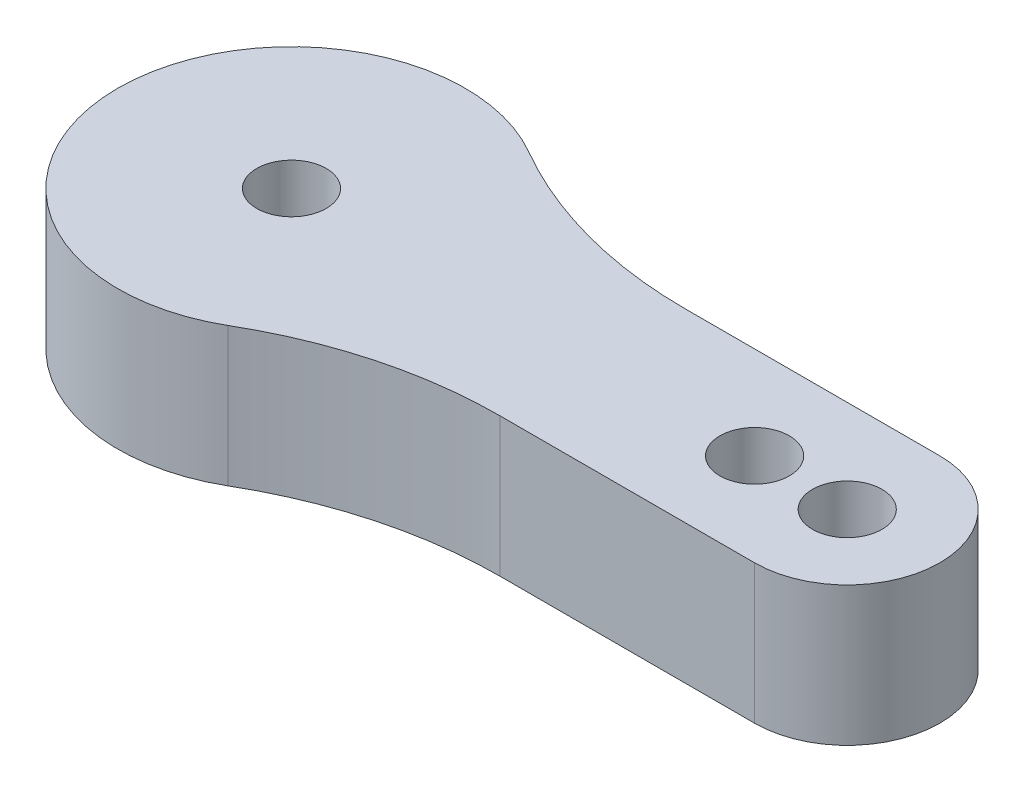
ISO-10303-21;
HEADER;
FILE_DESCRIPTION(('STEP AP214'),'2;1');
FILE_NAME('part.step','',(''),(''),'','','');
FILE_SCHEMA(('AUTOMOTIVE_DESIGN { 1 0 10303 214 1 1 1 1 }'));
ENDSEC;
DATA;
#1=APPLICATION_CONTEXT('core data for automotive mechanical design processes');
#2=APPLICATION_PROTOCOL_DEFINITION('international standard','automotive_design',2000,#1);
#3=PRODUCT_CONTEXT('',#1,'mechanical');
#4=PRODUCT('Part','Part','',(#3));
#5=PRODUCT_RELATED_PRODUCT_CATEGORY('part','',(#4));
#6=PRODUCT_DEFINITION_FORMATION('','',#4);
#7=PRODUCT_DEFINITION_CONTEXT('part definition',#1,'design');
#8=PRODUCT_DEFINITION('design','',#6,#7);
#9=PRODUCT_DEFINITION_SHAPE('','',#8);
#10=(LENGTH_UNIT() NAMED_UNIT(*) SI_UNIT(.MILLI.,.METRE.));
#11=(NAMED_UNIT(*) PLANE_ANGLE_UNIT() SI_UNIT($,.RADIAN.));
#12=(NAMED_UNIT(*) SI_UNIT($,.STERADIAN.) SOLID_ANGLE_UNIT());
#13=UNCERTAINTY_MEASURE_WITH_UNIT(LENGTH_MEASURE(1.E-05),#10,'distance_accuracy_value','');
#14=(GEOMETRIC_REPRESENTATION_CONTEXT(3) GLOBAL_UNCERTAINTY_ASSIGNED_CONTEXT((#13)) GLOBAL_UNIT_ASSIGNED_CONTEXT((#10,
#11,#12)) REPRESENTATION_CONTEXT('',''));
#15=CARTESIAN_POINT('',(0.,0.,0.));
#16=DIRECTION('',(0.,0.,1.));
#17=DIRECTION('',(1.,0.,0.));
#18=AXIS2_PLACEMENT_3D('',#15,#16,#17);
#19=CARTESIAN_POINT('',(16.3682653243977,6.,-10.0000000000006));
#20=DIRECTION('',(0.,1.,0.));
#21=DIRECTION('',(0.,0.,1.));
#22=AXIS2_PLACEMENT_3D('',#19,#20,#21);
#23=PLANE('',#22);
#24=CARTESIAN_POINT('',(12.3682653243977,6.,-10.0000000000006));
#25=DIRECTION('',(0.,1.,0.));
#26=DIRECTION('',(0.,0.,1.));
#27=AXIS2_PLACEMENT_3D('',#24,#25,#26);
#28=CIRCLE('',#27,1.5);
#29=CARTESIAN_POINT('',(12.3682653243977,6.,-8.50000000000061));
#30=VERTEX_POINT('',#29);
#31=EDGE_CURVE('E190',#30,#30,#28,.T.);
#32=ORIENTED_EDGE('',*,*,#31,.F.);
#33=EDGE_LOOP('',(#32));
#34=FACE_BOUND('',#33,.T.);
#35=CARTESIAN_POINT('',(16.3682653243977,6.,-10.0000000000006));
#36=DIRECTION('',(0.,1.,0.));
#37=DIRECTION('',(0.,0.,1.));
#38=AXIS2_PLACEMENT_3D('',#35,#36,#37);
#39=CIRCLE('',#38,4.);
#40=CARTESIAN_POINT('',(16.3682653243977,6.,-6.00000000000062));
#41=VERTEX_POINT('',#40);
#42=CARTESIAN_POINT('',(16.3682653243977,6.,-14.0000000000006));
#43=VERTEX_POINT('',#42);
#44=EDGE_CURVE('E135',#41,#43,#39,.T.);
#45=ORIENTED_EDGE('',*,*,#44,.T.);
#46=DIRECTION('',(-1.,0.,0.));
#47=VECTOR('',#46,1.);
#48=CARTESIAN_POINT('',(16.3682653243977,6.,-14.0000000000006));
#49=LINE('',#48,#47);
#50=CARTESIAN_POINT('',(5.36826532439773,6.,-14.0000000000006));
#51=VERTEX_POINT('',#50);
#52=EDGE_CURVE('E93',#43,#51,#49,.T.);
#53=ORIENTED_EDGE('',*,*,#52,.T.);
#54=CARTESIAN_POINT('',(5.36826532439773,6.,-32.3930795522075));
#55=DIRECTION('',(0.,-1.,0.));
#56=DIRECTION('',(0.,0.,-1.));
#57=AXIS2_PLACEMENT_3D('',#54,#55,#56);
#58=CIRCLE('',#57,18.3930795522069);
#59=CARTESIAN_POINT('',(-3.88173467560219,6.,-16.4951905283838));
#60=VERTEX_POINT('',#59);
#61=EDGE_CURVE('E106',#51,#60,#58,.T.);
#62=ORIENTED_EDGE('',*,*,#61,.T.);
#63=CARTESIAN_POINT('',(-7.63173467560227,6.,-10.0000000000006));
#64=DIRECTION('',(0.,1.,0.));
#65=DIRECTION('',(0.,0.,1.));
#66=AXIS2_PLACEMENT_3D('',#63,#64,#65);
#67=CIRCLE('',#66,7.49999999999999);
#68=CARTESIAN_POINT('',(-3.8817346756022,6.,-3.50480947161738));
#69=VERTEX_POINT('',#68);
#70=EDGE_CURVE('E100',#60,#69,#67,.T.);
#71=ORIENTED_EDGE('',*,*,#70,.T.);
#72=CARTESIAN_POINT('',(5.36826532439773,6.,12.3930795522063));
#73=DIRECTION('',(0.,-1.,0.));
#74=DIRECTION('',(0.,0.,1.));
#75=AXIS2_PLACEMENT_3D('',#72,#73,#74);
#76=CIRCLE('',#75,18.3930795522069);
#77=CARTESIAN_POINT('',(5.36826532439773,6.,-6.00000000000061));
#78=VERTEX_POINT('',#77);
#79=EDGE_CURVE('E104',#69,#78,#76,.T.);
#80=ORIENTED_EDGE('',*,*,#79,.T.);
#81=DIRECTION('',(1.,0.,0.));
#82=VECTOR('',#81,1.);
#83=CARTESIAN_POINT('',(16.3682653243977,6.,-6.00000000000062));
#84=LINE('',#83,#82);
#85=EDGE_CURVE('E56',#78,#41,#84,.T.);
#86=ORIENTED_EDGE('',*,*,#85,.T.);
#87=EDGE_LOOP('',(#45,#53,#62,#71,#80,#86));
#88=FACE_BOUND('',#87,.T.);
#89=CARTESIAN_POINT('',(-7.63173467560227,6.,-10.0000000000006));
#90=DIRECTION('',(0.,1.,0.));
#91=DIRECTION('',(0.,0.,1.));
#92=AXIS2_PLACEMENT_3D('',#89,#90,#91);
#93=CIRCLE('',#92,1.5);
#94=CARTESIAN_POINT('',(-7.63173467560227,6.,-8.50000000000062));
#95=VERTEX_POINT('',#94);
#96=EDGE_CURVE('E128',#95,#95,#93,.T.);
#97=ORIENTED_EDGE('',*,*,#96,.F.);
#98=EDGE_LOOP('',(#97));
#99=FACE_BOUND('',#98,.T.);
#100=CARTESIAN_POINT('',(16.3682653243977,6.,-10.0000000000006));
#101=DIRECTION('',(0.,1.,0.));
#102=DIRECTION('',(0.,0.,1.));
#103=AXIS2_PLACEMENT_3D('',#100,#101,#102);
#104=CIRCLE('',#103,1.5);
#105=CARTESIAN_POINT('',(16.3682653243977,6.,-8.50000000000061));
#106=VERTEX_POINT('',#105);
#107=EDGE_CURVE('E181',#106,#106,#104,.T.);
#108=ORIENTED_EDGE('',*,*,#107,.F.);
#109=EDGE_LOOP('',(#108));
#110=FACE_BOUND('',#109,.T.);
#111=ADVANCED_FACE('F39',(#34,#88,#99,#110),#23,.T.);
#112=CARTESIAN_POINT('',(16.3682653243977,0.,-10.0000000000006));
#113=DIRECTION('',(0.,1.,0.));
#114=DIRECTION('',(0.,0.,1.));
#115=AXIS2_PLACEMENT_3D('',#112,#113,#114);
#116=PLANE('',#115);
#117=CARTESIAN_POINT('',(16.3682653243977,0.,-10.0000000000006));
#118=DIRECTION('',(0.,1.,0.));
#119=DIRECTION('',(0.,0.,1.));
#120=AXIS2_PLACEMENT_3D('',#117,#118,#119);
#121=CIRCLE('',#120,4.);
#122=CARTESIAN_POINT('',(16.3682653243977,0.,-6.00000000000062));
#123=VERTEX_POINT('',#122);
#124=CARTESIAN_POINT('',(16.3682653243977,0.,-14.0000000000006));
#125=VERTEX_POINT('',#124);
#126=EDGE_CURVE('E124',#123,#125,#121,.T.);
#127=ORIENTED_EDGE('',*,*,#126,.F.);
#128=DIRECTION('',(1.,0.,0.));
#129=VECTOR('',#128,1.);
#130=CARTESIAN_POINT('',(16.3682653243977,0.,-6.00000000000062));
#131=LINE('',#130,#129);
#132=CARTESIAN_POINT('',(5.36826532439773,0.,-6.00000000000061));
#133=VERTEX_POINT('',#132);
#134=EDGE_CURVE('E85',#133,#123,#131,.T.);
#135=ORIENTED_EDGE('',*,*,#134,.F.);
#136=CARTESIAN_POINT('',(5.36826532439773,0.,12.3930795522063));
#137=DIRECTION('',(0.,-1.,0.));
#138=DIRECTION('',(0.,0.,1.));
#139=AXIS2_PLACEMENT_3D('',#136,#137,#138);
#140=CIRCLE('',#139,18.3930795522069);
#141=CARTESIAN_POINT('',(-3.8817346756022,0.,-3.50480947161738));
#142=VERTEX_POINT('',#141);
#143=EDGE_CURVE('E79',#142,#133,#140,.T.);
#144=ORIENTED_EDGE('',*,*,#143,.F.);
#145=CARTESIAN_POINT('',(-7.63173467560227,0.,-10.0000000000006));
#146=DIRECTION('',(0.,1.,0.));
#147=DIRECTION('',(0.,0.,1.));
#148=AXIS2_PLACEMENT_3D('',#145,#146,#147);
#149=CIRCLE('',#148,7.49999999999999);
#150=CARTESIAN_POINT('',(-3.88173467560219,0.,-16.4951905283838));
#151=VERTEX_POINT('',#150);
#152=EDGE_CURVE('E114',#151,#142,#149,.T.);
#153=ORIENTED_EDGE('',*,*,#152,.F.);
#154=CARTESIAN_POINT('',(5.36826532439773,0.,-32.3930795522075));
#155=DIRECTION('',(0.,-1.,0.));
#156=DIRECTION('',(0.,0.,-1.));
#157=AXIS2_PLACEMENT_3D('',#154,#155,#156);
#158=CIRCLE('',#157,18.3930795522069);
#159=CARTESIAN_POINT('',(5.36826532439773,0.,-14.0000000000006));
#160=VERTEX_POINT('',#159);
#161=EDGE_CURVE('E130',#160,#151,#158,.T.);
#162=ORIENTED_EDGE('',*,*,#161,.F.);
#163=DIRECTION('',(-1.,0.,0.));
#164=VECTOR('',#163,1.);
#165=CARTESIAN_POINT('',(16.3682653243977,0.,-14.0000000000006));
#166=LINE('',#165,#164);
#167=EDGE_CURVE('E127',#125,#160,#166,.T.);
#168=ORIENTED_EDGE('',*,*,#167,.F.);
#169=EDGE_LOOP('',(#127,#135,#144,#153,#162,#168));
#170=FACE_BOUND('',#169,.T.);
#171=CARTESIAN_POINT('',(-7.63173467560227,0.,-10.0000000000006));
#172=DIRECTION('',(0.,1.,0.));
#173=DIRECTION('',(0.,0.,1.));
#174=AXIS2_PLACEMENT_3D('',#171,#172,#173);
#175=CIRCLE('',#174,1.5);
#176=CARTESIAN_POINT('',(-7.63173467560227,0.,-8.50000000000062));
#177=VERTEX_POINT('',#176);
#178=EDGE_CURVE('E193',#177,#177,#175,.T.);
#179=ORIENTED_EDGE('',*,*,#178,.T.);
#180=EDGE_LOOP('',(#179));
#181=FACE_BOUND('',#180,.T.);
#182=CARTESIAN_POINT('',(12.3682653243977,0.,-10.0000000000006));
#183=DIRECTION('',(0.,1.,0.));
#184=DIRECTION('',(0.,0.,1.));
#185=AXIS2_PLACEMENT_3D('',#182,#183,#184);
#186=CIRCLE('',#185,1.5);
#187=CARTESIAN_POINT('',(12.3682653243977,0.,-8.50000000000061));
#188=VERTEX_POINT('',#187);
#189=EDGE_CURVE('E187',#188,#188,#186,.T.);
#190=ORIENTED_EDGE('',*,*,#189,.T.);
#191=EDGE_LOOP('',(#190));
#192=FACE_BOUND('',#191,.T.);
#193=CARTESIAN_POINT('',(16.3682653243977,0.,-10.0000000000006));
#194=DIRECTION('',(0.,1.,0.));
#195=DIRECTION('',(0.,0.,1.));
#196=AXIS2_PLACEMENT_3D('',#193,#194,#195);
#197=CIRCLE('',#196,1.5);
#198=CARTESIAN_POINT('',(16.3682653243977,0.,-8.50000000000061));
#199=VERTEX_POINT('',#198);
#200=EDGE_CURVE('E184',#199,#199,#197,.T.);
#201=ORIENTED_EDGE('',*,*,#200,.T.);
#202=EDGE_LOOP('',(#201));
#203=FACE_BOUND('',#202,.T.);
#204=ADVANCED_FACE('F144',(#170,#181,#192,#203),#116,.F.);
#205=CARTESIAN_POINT('',(16.3682653243977,6.,-10.0000000000006));
#206=DIRECTION('',(0.,-1.,0.));
#207=DIRECTION('',(0.,0.,-1.));
#208=AXIS2_PLACEMENT_3D('',#205,#206,#207);
#209=CYLINDRICAL_SURFACE('',#208,4.);
#210=ORIENTED_EDGE('',*,*,#126,.T.);
#211=DIRECTION('',(0.,-1.,0.));
#212=VECTOR('',#211,1.);
#213=CARTESIAN_POINT('',(16.3682653243977,6.,-14.0000000000006));
#214=LINE('',#213,#212);
#215=EDGE_CURVE('E11',#43,#125,#214,.T.);
#216=ORIENTED_EDGE('',*,*,#215,.F.);
#217=ORIENTED_EDGE('',*,*,#44,.F.);
#218=DIRECTION('',(0.,-1.,0.));
#219=VECTOR('',#218,1.);
#220=CARTESIAN_POINT('',(16.3682653243977,6.,-6.00000000000062));
#221=LINE('',#220,#219);
#222=EDGE_CURVE('E120',#41,#123,#221,.T.);
#223=ORIENTED_EDGE('',*,*,#222,.T.);
#224=EDGE_LOOP('',(#210,#216,#217,#223));
#225=FACE_BOUND('',#224,.T.);
#226=ADVANCED_FACE('F41',(#225),#209,.T.);
#227=CARTESIAN_POINT('',(16.3682653243977,6.,-14.0000000000006));
#228=DIRECTION('',(0.,0.,1.));
#229=DIRECTION('',(1.,0.,0.));
#230=AXIS2_PLACEMENT_3D('',#227,#228,#229);
#231=PLANE('',#230);
#232=ORIENTED_EDGE('',*,*,#167,.T.);
#233=DIRECTION('',(0.,-1.,0.));
#234=VECTOR('',#233,1.);
#235=CARTESIAN_POINT('',(5.36826532439773,6.,-14.0000000000006));
#236=LINE('',#235,#234);
#237=EDGE_CURVE('E48',#51,#160,#236,.T.);
#238=ORIENTED_EDGE('',*,*,#237,.F.);
#239=ORIENTED_EDGE('',*,*,#52,.F.);
#240=ORIENTED_EDGE('',*,*,#215,.T.);
#241=EDGE_LOOP('',(#232,#238,#239,#240));
#242=FACE_BOUND('',#241,.T.);
#243=ADVANCED_FACE('F247',(#242),#231,.F.);
#244=CARTESIAN_POINT('',(5.36826532439773,6.,-32.3930795522075));
#245=DIRECTION('',(0.,-1.,0.));
#246=DIRECTION('',(0.,0.,-1.));
#247=AXIS2_PLACEMENT_3D('',#244,#245,#246);
#248=CYLINDRICAL_SURFACE('',#247,18.3930795522069);
#249=ORIENTED_EDGE('',*,*,#161,.T.);
#250=DIRECTION('',(0.,-1.,0.));
#251=VECTOR('',#250,1.);
#252=CARTESIAN_POINT('',(-3.88173467560219,6.,-16.4951905283838));
#253=LINE('',#252,#251);
#254=EDGE_CURVE('E115',#60,#151,#253,.T.);
#255=ORIENTED_EDGE('',*,*,#254,.F.);
#256=ORIENTED_EDGE('',*,*,#61,.F.);
#257=ORIENTED_EDGE('',*,*,#237,.T.);
#258=EDGE_LOOP('',(#249,#255,#256,#257));
#259=FACE_BOUND('',#258,.T.);
#260=ADVANCED_FACE('F141',(#259),#248,.F.);
#261=CARTESIAN_POINT('',(-7.63173467560227,6.,-10.0000000000006));
#262=DIRECTION('',(0.,-1.,0.));
#263=DIRECTION('',(0.,0.,-1.));
#264=AXIS2_PLACEMENT_3D('',#261,#262,#263);
#265=CYLINDRICAL_SURFACE('',#264,7.49999999999999);
#266=ORIENTED_EDGE('',*,*,#152,.T.);
#267=DIRECTION('',(0.,-1.,0.));
#268=VECTOR('',#267,1.);
#269=CARTESIAN_POINT('',(-3.8817346756022,6.,-3.50480947161738));
#270=LINE('',#269,#268);
#271=EDGE_CURVE('E111',#69,#142,#270,.T.);
#272=ORIENTED_EDGE('',*,*,#271,.F.);
#273=ORIENTED_EDGE('',*,*,#70,.F.);
#274=ORIENTED_EDGE('',*,*,#254,.T.);
#275=EDGE_LOOP('',(#266,#272,#273,#274));
#276=FACE_BOUND('',#275,.T.);
#277=ADVANCED_FACE('F112',(#276),#265,.T.);
#278=CARTESIAN_POINT('',(5.36826532439773,6.,12.3930795522063));
#279=DIRECTION('',(0.,-1.,0.));
#280=DIRECTION('',(0.,0.,-1.));
#281=AXIS2_PLACEMENT_3D('',#278,#279,#280);
#282=CYLINDRICAL_SURFACE('',#281,18.3930795522069);
#283=ORIENTED_EDGE('',*,*,#143,.T.);
#284=DIRECTION('',(0.,-1.,0.));
#285=VECTOR('',#284,1.);
#286=CARTESIAN_POINT('',(5.36826532439773,6.,-6.00000000000061));
#287=LINE('',#286,#285);
#288=EDGE_CURVE('E116',#78,#133,#287,.T.);
#289=ORIENTED_EDGE('',*,*,#288,.F.);
#290=ORIENTED_EDGE('',*,*,#79,.F.);
#291=ORIENTED_EDGE('',*,*,#271,.T.);
#292=EDGE_LOOP('',(#283,#289,#290,#291));
#293=FACE_BOUND('',#292,.T.);
#294=ADVANCED_FACE('F118',(#293),#282,.F.);
#295=CARTESIAN_POINT('',(16.3682653243977,6.,-6.00000000000062));
#296=DIRECTION('',(0.,0.,-1.));
#297=DIRECTION('',(-1.,0.,0.));
#298=AXIS2_PLACEMENT_3D('',#295,#296,#297);
#299=PLANE('',#298);
#300=ORIENTED_EDGE('',*,*,#134,.T.);
#301=ORIENTED_EDGE('',*,*,#222,.F.);
#302=ORIENTED_EDGE('',*,*,#85,.F.);
#303=ORIENTED_EDGE('',*,*,#288,.T.);
#304=EDGE_LOOP('',(#300,#301,#302,#303));
#305=FACE_BOUND('',#304,.T.);
#306=ADVANCED_FACE('F149',(#305),#299,.F.);
#307=CARTESIAN_POINT('',(-7.63173467560227,6.,-10.0000000000006));
#308=DIRECTION('',(0.,-1.,0.));
#309=DIRECTION('',(0.,0.,-1.));
#310=AXIS2_PLACEMENT_3D('',#307,#308,#309);
#311=CYLINDRICAL_SURFACE('',#310,1.5);
#312=ORIENTED_EDGE('',*,*,#96,.T.);
#313=EDGE_LOOP('',(#312));
#314=FACE_BOUND('',#313,.T.);
#315=ORIENTED_EDGE('',*,*,#178,.F.);
#316=EDGE_LOOP('',(#315));
#317=FACE_BOUND('',#316,.T.);
#318=ADVANCED_FACE('F151',(#314,#317),#311,.F.);
#319=CARTESIAN_POINT('',(12.3682653243977,6.,-10.0000000000006));
#320=DIRECTION('',(0.,-1.,0.));
#321=DIRECTION('',(0.,0.,-1.));
#322=AXIS2_PLACEMENT_3D('',#319,#320,#321);
#323=CYLINDRICAL_SURFACE('',#322,1.5);
#324=ORIENTED_EDGE('',*,*,#31,.T.);
#325=EDGE_LOOP('',(#324));
#326=FACE_BOUND('',#325,.T.);
#327=ORIENTED_EDGE('',*,*,#189,.F.);
#328=EDGE_LOOP('',(#327));
#329=FACE_BOUND('',#328,.T.);
#330=ADVANCED_FACE('F157',(#326,#329),#323,.F.);
#331=CARTESIAN_POINT('',(16.3682653243977,6.,-10.0000000000006));
#332=DIRECTION('',(0.,-1.,0.));
#333=DIRECTION('',(0.,0.,-1.));
#334=AXIS2_PLACEMENT_3D('',#331,#332,#333);
#335=CYLINDRICAL_SURFACE('',#334,1.5);
#336=ORIENTED_EDGE('',*,*,#107,.T.);
#337=EDGE_LOOP('',(#336));
#338=FACE_BOUND('',#337,.T.);
#339=ORIENTED_EDGE('',*,*,#200,.F.);
#340=EDGE_LOOP('',(#339));
#341=FACE_BOUND('',#340,.T.);
#342=ADVANCED_FACE('F172',(#338,#341),#335,.F.);
#343=CLOSED_SHELL('',(#111,#204,#226,#243,#260,#277,#294,#306,#318,#330,#342));
#344=MANIFOLD_SOLID_BREP('B2',#343);
#345=ADVANCED_BREP_SHAPE_REPRESENTATION('',(#18,#344),#14);
#346=SHAPE_DEFINITION_REPRESENTATION(#9,#345);
ENDSEC;
END-ISO-10303-21;
